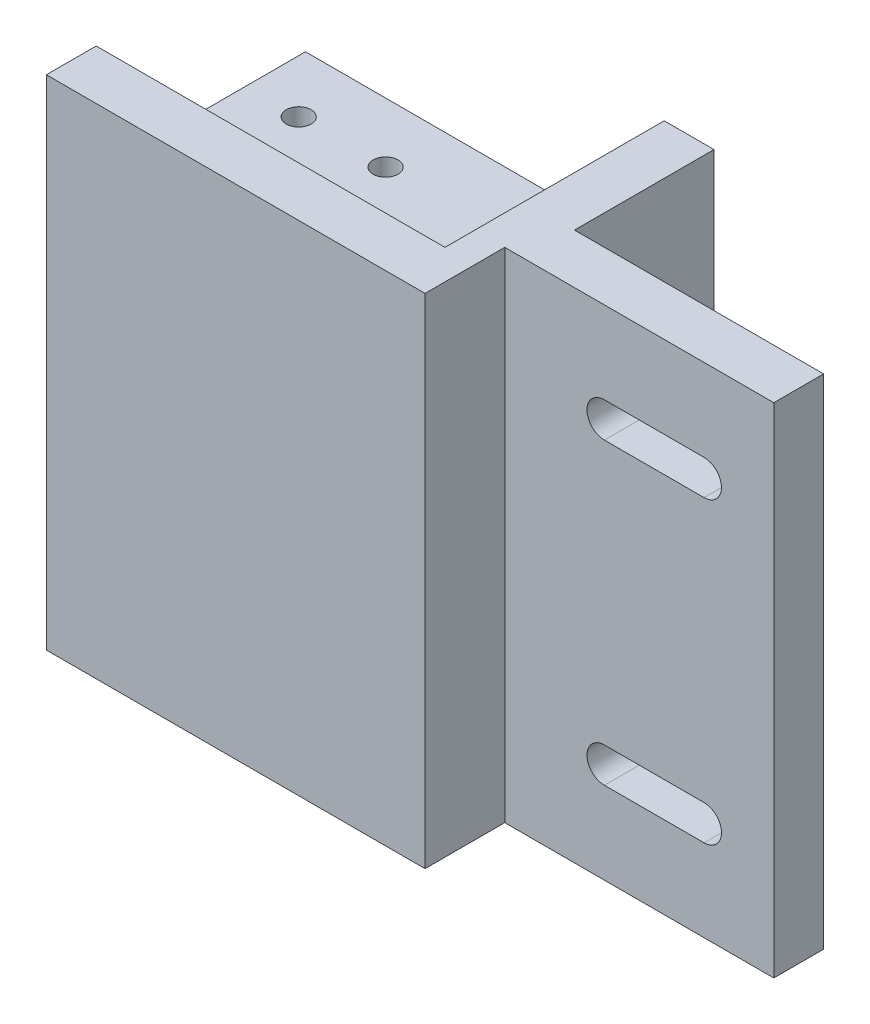
ISO-10303-21;
HEADER;
FILE_DESCRIPTION(('STEP AP214'),'2;1');
FILE_NAME('part.step','',(''),(''),'','','');
FILE_SCHEMA(('AUTOMOTIVE_DESIGN { 1 0 10303 214 1 1 1 1 }'));
ENDSEC;
DATA;
#1=APPLICATION_CONTEXT('core data for automotive mechanical design processes');
#2=APPLICATION_PROTOCOL_DEFINITION('international standard','automotive_design',2000,#1);
#3=PRODUCT_CONTEXT('',#1,'mechanical');
#4=PRODUCT('Part','Part','',(#3));
#5=PRODUCT_RELATED_PRODUCT_CATEGORY('part','',(#4));
#6=PRODUCT_DEFINITION_FORMATION('','',#4);
#7=PRODUCT_DEFINITION_CONTEXT('part definition',#1,'design');
#8=PRODUCT_DEFINITION('design','',#6,#7);
#9=PRODUCT_DEFINITION_SHAPE('','',#8);
#10=(LENGTH_UNIT() NAMED_UNIT(*) SI_UNIT(.MILLI.,.METRE.));
#11=(NAMED_UNIT(*) PLANE_ANGLE_UNIT() SI_UNIT($,.RADIAN.));
#12=(NAMED_UNIT(*) SI_UNIT($,.STERADIAN.) SOLID_ANGLE_UNIT());
#13=UNCERTAINTY_MEASURE_WITH_UNIT(LENGTH_MEASURE(1.E-05),#10,'distance_accuracy_value','');
#14=(GEOMETRIC_REPRESENTATION_CONTEXT(3) GLOBAL_UNCERTAINTY_ASSIGNED_CONTEXT((#13)) GLOBAL_UNIT_ASSIGNED_CONTEXT((#10,
#11,#12)) REPRESENTATION_CONTEXT('',''));
#15=CARTESIAN_POINT('',(0.,0.,0.));
#16=DIRECTION('',(0.,0.,1.));
#17=DIRECTION('',(1.,0.,0.));
#18=AXIS2_PLACEMENT_3D('',#15,#16,#17);
#19=CARTESIAN_POINT('',(50.,-25.,5.));
#20=DIRECTION('',(-1.,0.,0.));
#21=DIRECTION('',(0.,0.,1.));
#22=AXIS2_PLACEMENT_3D('',#19,#20,#21);
#23=PLANE('',#22);
#24=DIRECTION('',(0.,1.,0.));
#25=VECTOR('',#24,1.);
#26=CARTESIAN_POINT('',(50.,-25.,-3.));
#27=LINE('',#26,#25);
#28=CARTESIAN_POINT('',(50.,-25.,-3.));
#29=VERTEX_POINT('',#28);
#30=CARTESIAN_POINT('',(50.,25.,-3.));
#31=VERTEX_POINT('',#30);
#32=EDGE_CURVE('E180',#29,#31,#27,.T.);
#33=ORIENTED_EDGE('',*,*,#32,.F.);
#34=DIRECTION('',(0.,0.,-1.));
#35=VECTOR('',#34,1.);
#36=CARTESIAN_POINT('',(50.,-25.,5.));
#37=LINE('',#36,#35);
#38=CARTESIAN_POINT('',(50.,-25.,-8.));
#39=VERTEX_POINT('',#38);
#40=EDGE_CURVE('E203',#29,#39,#37,.T.);
#41=ORIENTED_EDGE('',*,*,#40,.T.);
#42=DIRECTION('',(0.,-1.,0.));
#43=VECTOR('',#42,1.);
#44=CARTESIAN_POINT('',(50.,25.,-8.));
#45=LINE('',#44,#43);
#46=CARTESIAN_POINT('',(50.,25.,-8.));
#47=VERTEX_POINT('',#46);
#48=EDGE_CURVE('E201',#47,#39,#45,.T.);
#49=ORIENTED_EDGE('',*,*,#48,.F.);
#50=DIRECTION('',(0.,0.,-1.));
#51=VECTOR('',#50,1.);
#52=CARTESIAN_POINT('',(50.,25.,5.));
#53=LINE('',#52,#51);
#54=EDGE_CURVE('E195',#31,#47,#53,.T.);
#55=ORIENTED_EDGE('',*,*,#54,.F.);
#56=EDGE_LOOP('',(#33,#41,#49,#55));
#57=FACE_BOUND('',#56,.T.);
#58=ADVANCED_FACE('F34',(#57),#23,.F.);
#59=CARTESIAN_POINT('',(33.,15.,5.));
#60=DIRECTION('',(0.,0.,-1.));
#61=DIRECTION('',(-1.,0.,0.));
#62=AXIS2_PLACEMENT_3D('',#59,#60,#61);
#63=CYLINDRICAL_SURFACE('',#62,1.75);
#64=DIRECTION('',(0.,0.,-1.));
#65=VECTOR('',#64,1.);
#66=CARTESIAN_POINT('',(33.,16.75,5.));
#67=LINE('',#66,#65);
#68=CARTESIAN_POINT('',(33.,16.75,-3.));
#69=VERTEX_POINT('',#68);
#70=CARTESIAN_POINT('',(33.,16.75,-8.));
#71=VERTEX_POINT('',#70);
#72=EDGE_CURVE('E340',#69,#71,#67,.T.);
#73=ORIENTED_EDGE('',*,*,#72,.F.);
#74=CARTESIAN_POINT('',(33.,15.,-3.));
#75=DIRECTION('',(0.,0.,1.));
#76=DIRECTION('',(1.,0.,0.));
#77=AXIS2_PLACEMENT_3D('',#74,#75,#76);
#78=CIRCLE('',#77,1.75);
#79=CARTESIAN_POINT('',(33.,13.25,-3.));
#80=VERTEX_POINT('',#79);
#81=EDGE_CURVE('E56',#69,#80,#78,.T.);
#82=ORIENTED_EDGE('',*,*,#81,.T.);
#83=DIRECTION('',(0.,0.,-1.));
#84=VECTOR('',#83,1.);
#85=CARTESIAN_POINT('',(33.,13.25,5.));
#86=LINE('',#85,#84);
#87=CARTESIAN_POINT('',(33.,13.25,-8.));
#88=VERTEX_POINT('',#87);
#89=EDGE_CURVE('E334',#80,#88,#86,.T.);
#90=ORIENTED_EDGE('',*,*,#89,.T.);
#91=CARTESIAN_POINT('',(33.,15.,-8.));
#92=DIRECTION('',(0.,0.,1.));
#93=DIRECTION('',(1.,0.,0.));
#94=AXIS2_PLACEMENT_3D('',#91,#92,#93);
#95=CIRCLE('',#94,1.75);
#96=EDGE_CURVE('E217',#88,#71,#95,.F.);
#97=ORIENTED_EDGE('',*,*,#96,.T.);
#98=EDGE_LOOP('',(#73,#82,#90,#97));
#99=FACE_BOUND('',#98,.T.);
#100=ADVANCED_FACE('F427',(#99),#63,.F.);
#101=CARTESIAN_POINT('',(33.,13.25,5.));
#102=DIRECTION('',(0.,1.,0.));
#103=DIRECTION('',(0.,0.,1.));
#104=AXIS2_PLACEMENT_3D('',#101,#102,#103);
#105=PLANE('',#104);
#106=ORIENTED_EDGE('',*,*,#89,.F.);
#107=DIRECTION('',(1.,0.,0.));
#108=VECTOR('',#107,1.);
#109=CARTESIAN_POINT('',(33.,13.25,-3.));
#110=LINE('',#109,#108);
#111=CARTESIAN_POINT('',(43.,13.25,-3.));
#112=VERTEX_POINT('',#111);
#113=EDGE_CURVE('E356',#80,#112,#110,.T.);
#114=ORIENTED_EDGE('',*,*,#113,.T.);
#115=DIRECTION('',(0.,0.,-1.));
#116=VECTOR('',#115,1.);
#117=CARTESIAN_POINT('',(43.,13.25,5.));
#118=LINE('',#117,#116);
#119=CARTESIAN_POINT('',(43.,13.25,-8.));
#120=VERTEX_POINT('',#119);
#121=EDGE_CURVE('E336',#112,#120,#118,.T.);
#122=ORIENTED_EDGE('',*,*,#121,.T.);
#123=DIRECTION('',(-1.,0.,0.));
#124=VECTOR('',#123,1.);
#125=CARTESIAN_POINT('',(0.,13.25,-8.));
#126=LINE('',#125,#124);
#127=EDGE_CURVE('E214',#120,#88,#126,.T.);
#128=ORIENTED_EDGE('',*,*,#127,.T.);
#129=EDGE_LOOP('',(#106,#114,#122,#128));
#130=FACE_BOUND('',#129,.T.);
#131=ADVANCED_FACE('F431',(#130),#105,.T.);
#132=CARTESIAN_POINT('',(43.,15.,5.));
#133=DIRECTION('',(0.,0.,-1.));
#134=DIRECTION('',(-1.,0.,0.));
#135=AXIS2_PLACEMENT_3D('',#132,#133,#134);
#136=CYLINDRICAL_SURFACE('',#135,1.75);
#137=ORIENTED_EDGE('',*,*,#121,.F.);
#138=CARTESIAN_POINT('',(43.,15.,-3.));
#139=DIRECTION('',(0.,0.,1.));
#140=DIRECTION('',(1.,0.,0.));
#141=AXIS2_PLACEMENT_3D('',#138,#139,#140);
#142=CIRCLE('',#141,1.75);
#143=CARTESIAN_POINT('',(43.,16.75,-3.));
#144=VERTEX_POINT('',#143);
#145=EDGE_CURVE('E359',#112,#144,#142,.T.);
#146=ORIENTED_EDGE('',*,*,#145,.T.);
#147=DIRECTION('',(0.,0.,-1.));
#148=VECTOR('',#147,1.);
#149=CARTESIAN_POINT('',(43.,16.75,5.));
#150=LINE('',#149,#148);
#151=CARTESIAN_POINT('',(43.,16.75,-8.));
#152=VERTEX_POINT('',#151);
#153=EDGE_CURVE('E338',#144,#152,#150,.T.);
#154=ORIENTED_EDGE('',*,*,#153,.T.);
#155=CARTESIAN_POINT('',(43.,15.,-8.));
#156=DIRECTION('',(0.,0.,1.));
#157=DIRECTION('',(1.,0.,0.));
#158=AXIS2_PLACEMENT_3D('',#155,#156,#157);
#159=CIRCLE('',#158,1.75);
#160=EDGE_CURVE('E206',#152,#120,#159,.F.);
#161=ORIENTED_EDGE('',*,*,#160,.T.);
#162=EDGE_LOOP('',(#137,#146,#154,#161));
#163=FACE_BOUND('',#162,.T.);
#164=ADVANCED_FACE('F437',(#163),#136,.F.);
#165=CARTESIAN_POINT('',(33.,16.75,5.));
#166=DIRECTION('',(0.,-1.,0.));
#167=DIRECTION('',(0.,0.,-1.));
#168=AXIS2_PLACEMENT_3D('',#165,#166,#167);
#169=PLANE('',#168);
#170=ORIENTED_EDGE('',*,*,#153,.F.);
#171=DIRECTION('',(-1.,0.,0.));
#172=VECTOR('',#171,1.);
#173=CARTESIAN_POINT('',(33.,16.75,-3.));
#174=LINE('',#173,#172);
#175=EDGE_CURVE('E362',#144,#69,#174,.T.);
#176=ORIENTED_EDGE('',*,*,#175,.T.);
#177=ORIENTED_EDGE('',*,*,#72,.T.);
#178=DIRECTION('',(1.,0.,0.));
#179=VECTOR('',#178,1.);
#180=CARTESIAN_POINT('',(0.,16.75,-8.));
#181=LINE('',#180,#179);
#182=EDGE_CURVE('E202',#71,#152,#181,.T.);
#183=ORIENTED_EDGE('',*,*,#182,.T.);
#184=EDGE_LOOP('',(#170,#176,#177,#183));
#185=FACE_BOUND('',#184,.T.);
#186=ADVANCED_FACE('F569',(#185),#169,.T.);
#187=CARTESIAN_POINT('',(33.,-15.,5.));
#188=DIRECTION('',(0.,0.,-1.));
#189=DIRECTION('',(-1.,0.,0.));
#190=AXIS2_PLACEMENT_3D('',#187,#188,#189);
#191=CYLINDRICAL_SURFACE('',#190,1.75);
#192=DIRECTION('',(0.,0.,-1.));
#193=VECTOR('',#192,1.);
#194=CARTESIAN_POINT('',(33.,-13.25,5.));
#195=LINE('',#194,#193);
#196=CARTESIAN_POINT('',(33.,-13.25,-3.));
#197=VERTEX_POINT('',#196);
#198=CARTESIAN_POINT('',(33.,-13.25,-8.));
#199=VERTEX_POINT('',#198);
#200=EDGE_CURVE('E348',#197,#199,#195,.T.);
#201=ORIENTED_EDGE('',*,*,#200,.F.);
#202=CARTESIAN_POINT('',(33.,-15.,-3.));
#203=DIRECTION('',(0.,0.,1.));
#204=DIRECTION('',(1.,0.,0.));
#205=AXIS2_PLACEMENT_3D('',#202,#203,#204);
#206=CIRCLE('',#205,1.75);
#207=CARTESIAN_POINT('',(33.,-16.75,-3.));
#208=VERTEX_POINT('',#207);
#209=EDGE_CURVE('E364',#197,#208,#206,.T.);
#210=ORIENTED_EDGE('',*,*,#209,.T.);
#211=DIRECTION('',(0.,0.,-1.));
#212=VECTOR('',#211,1.);
#213=CARTESIAN_POINT('',(33.,-16.75,5.));
#214=LINE('',#213,#212);
#215=CARTESIAN_POINT('',(33.,-16.75,-8.));
#216=VERTEX_POINT('',#215);
#217=EDGE_CURVE('E342',#208,#216,#214,.T.);
#218=ORIENTED_EDGE('',*,*,#217,.T.);
#219=CARTESIAN_POINT('',(33.,-15.,-8.));
#220=DIRECTION('',(0.,0.,1.));
#221=DIRECTION('',(1.,0.,0.));
#222=AXIS2_PLACEMENT_3D('',#219,#220,#221);
#223=CIRCLE('',#222,1.75);
#224=EDGE_CURVE('E229',#216,#199,#223,.F.);
#225=ORIENTED_EDGE('',*,*,#224,.T.);
#226=EDGE_LOOP('',(#201,#210,#218,#225));
#227=FACE_BOUND('',#226,.T.);
#228=ADVANCED_FACE('F409',(#227),#191,.F.);
#229=CARTESIAN_POINT('',(33.,-16.75,5.));
#230=DIRECTION('',(0.,1.,0.));
#231=DIRECTION('',(0.,0.,1.));
#232=AXIS2_PLACEMENT_3D('',#229,#230,#231);
#233=PLANE('',#232);
#234=ORIENTED_EDGE('',*,*,#217,.F.);
#235=DIRECTION('',(1.,0.,0.));
#236=VECTOR('',#235,1.);
#237=CARTESIAN_POINT('',(33.,-16.75,-3.));
#238=LINE('',#237,#236);
#239=CARTESIAN_POINT('',(43.,-16.75,-3.));
#240=VERTEX_POINT('',#239);
#241=EDGE_CURVE('E367',#208,#240,#238,.T.);
#242=ORIENTED_EDGE('',*,*,#241,.T.);
#243=DIRECTION('',(0.,0.,-1.));
#244=VECTOR('',#243,1.);
#245=CARTESIAN_POINT('',(43.,-16.75,5.));
#246=LINE('',#245,#244);
#247=CARTESIAN_POINT('',(43.,-16.75,-8.));
#248=VERTEX_POINT('',#247);
#249=EDGE_CURVE('E344',#240,#248,#246,.T.);
#250=ORIENTED_EDGE('',*,*,#249,.T.);
#251=DIRECTION('',(-1.,0.,0.));
#252=VECTOR('',#251,1.);
#253=CARTESIAN_POINT('',(0.,-16.75,-8.));
#254=LINE('',#253,#252);
#255=EDGE_CURVE('E226',#248,#216,#254,.T.);
#256=ORIENTED_EDGE('',*,*,#255,.T.);
#257=EDGE_LOOP('',(#234,#242,#250,#256));
#258=FACE_BOUND('',#257,.T.);
#259=ADVANCED_FACE('F412',(#258),#233,.T.);
#260=CARTESIAN_POINT('',(43.,-15.,5.));
#261=DIRECTION('',(0.,0.,-1.));
#262=DIRECTION('',(-1.,0.,0.));
#263=AXIS2_PLACEMENT_3D('',#260,#261,#262);
#264=CYLINDRICAL_SURFACE('',#263,1.75);
#265=ORIENTED_EDGE('',*,*,#249,.F.);
#266=CARTESIAN_POINT('',(43.,-15.,-3.));
#267=DIRECTION('',(0.,0.,1.));
#268=DIRECTION('',(1.,0.,0.));
#269=AXIS2_PLACEMENT_3D('',#266,#267,#268);
#270=CIRCLE('',#269,1.75);
#271=CARTESIAN_POINT('',(43.,-13.25,-3.));
#272=VERTEX_POINT('',#271);
#273=EDGE_CURVE('E370',#240,#272,#270,.T.);
#274=ORIENTED_EDGE('',*,*,#273,.T.);
#275=DIRECTION('',(0.,0.,-1.));
#276=VECTOR('',#275,1.);
#277=CARTESIAN_POINT('',(43.,-13.25,5.));
#278=LINE('',#277,#276);
#279=CARTESIAN_POINT('',(43.,-13.25,-8.));
#280=VERTEX_POINT('',#279);
#281=EDGE_CURVE('E346',#272,#280,#278,.T.);
#282=ORIENTED_EDGE('',*,*,#281,.T.);
#283=CARTESIAN_POINT('',(43.,-15.,-8.));
#284=DIRECTION('',(0.,0.,1.));
#285=DIRECTION('',(1.,0.,0.));
#286=AXIS2_PLACEMENT_3D('',#283,#284,#285);
#287=CIRCLE('',#286,1.75);
#288=EDGE_CURVE('E223',#280,#248,#287,.F.);
#289=ORIENTED_EDGE('',*,*,#288,.T.);
#290=EDGE_LOOP('',(#265,#274,#282,#289));
#291=FACE_BOUND('',#290,.T.);
#292=ADVANCED_FACE('F415',(#291),#264,.F.);
#293=CARTESIAN_POINT('',(33.,-13.25,5.));
#294=DIRECTION('',(0.,-1.,0.));
#295=DIRECTION('',(0.,0.,-1.));
#296=AXIS2_PLACEMENT_3D('',#293,#294,#295);
#297=PLANE('',#296);
#298=ORIENTED_EDGE('',*,*,#281,.F.);
#299=DIRECTION('',(-1.,0.,0.));
#300=VECTOR('',#299,1.);
#301=CARTESIAN_POINT('',(33.,-13.25,-3.));
#302=LINE('',#301,#300);
#303=EDGE_CURVE('E12',#272,#197,#302,.T.);
#304=ORIENTED_EDGE('',*,*,#303,.T.);
#305=ORIENTED_EDGE('',*,*,#200,.T.);
#306=DIRECTION('',(1.,0.,0.));
#307=VECTOR('',#306,1.);
#308=CARTESIAN_POINT('',(0.,-13.25,-8.));
#309=LINE('',#308,#307);
#310=EDGE_CURVE('E220',#199,#280,#309,.T.);
#311=ORIENTED_EDGE('',*,*,#310,.T.);
#312=EDGE_LOOP('',(#298,#304,#305,#311));
#313=FACE_BOUND('',#312,.T.);
#314=ADVANCED_FACE('F418',(#313),#297,.T.);
#315=CARTESIAN_POINT('',(0.,0.,5.));
#316=DIRECTION('',(0.,0.,-1.));
#317=DIRECTION('',(-1.,0.,0.));
#318=AXIS2_PLACEMENT_3D('',#315,#316,#317);
#319=PLANE('',#318);
#320=DIRECTION('',(1.,0.,0.));
#321=VECTOR('',#320,1.);
#322=CARTESIAN_POINT('',(-50.,-25.,5.));
#323=LINE('',#322,#321);
#324=CARTESIAN_POINT('',(-15.,-25.,5.));
#325=VERTEX_POINT('',#324);
#326=CARTESIAN_POINT('',(23.,-25.,5.));
#327=VERTEX_POINT('',#326);
#328=EDGE_CURVE('E208',#325,#327,#323,.T.);
#329=ORIENTED_EDGE('',*,*,#328,.T.);
#330=DIRECTION('',(0.,-1.,0.));
#331=VECTOR('',#330,1.);
#332=CARTESIAN_POINT('',(23.,-25.,5.));
#333=LINE('',#332,#331);
#334=CARTESIAN_POINT('',(23.,25.,5.));
#335=VERTEX_POINT('',#334);
#336=EDGE_CURVE('E190',#335,#327,#333,.T.);
#337=ORIENTED_EDGE('',*,*,#336,.F.);
#338=DIRECTION('',(-1.,0.,0.));
#339=VECTOR('',#338,1.);
#340=CARTESIAN_POINT('',(-50.,25.,5.));
#341=LINE('',#340,#339);
#342=CARTESIAN_POINT('',(-15.,25.,5.));
#343=VERTEX_POINT('',#342);
#344=EDGE_CURVE('E253',#335,#343,#341,.T.);
#345=ORIENTED_EDGE('',*,*,#344,.T.);
#346=DIRECTION('',(0.,-1.,0.));
#347=VECTOR('',#346,1.);
#348=CARTESIAN_POINT('',(-15.,0.,5.));
#349=LINE('',#348,#347);
#350=EDGE_CURVE('E350',#343,#325,#349,.T.);
#351=ORIENTED_EDGE('',*,*,#350,.T.);
#352=EDGE_LOOP('',(#329,#337,#345,#351));
#353=FACE_BOUND('',#352,.T.);
#354=ADVANCED_FACE('F382',(#353),#319,.F.);
#355=CARTESIAN_POINT('',(0.,0.,-8.));
#356=DIRECTION('',(0.,0.,1.));
#357=DIRECTION('',(1.,0.,0.));
#358=AXIS2_PLACEMENT_3D('',#355,#356,#357);
#359=PLANE('',#358);
#360=ORIENTED_EDGE('',*,*,#96,.F.);
#361=ORIENTED_EDGE('',*,*,#127,.F.);
#362=ORIENTED_EDGE('',*,*,#160,.F.);
#363=ORIENTED_EDGE('',*,*,#182,.F.);
#364=EDGE_LOOP('',(#360,#361,#362,#363));
#365=FACE_BOUND('',#364,.T.);
#366=DIRECTION('',(0.,1.,0.));
#367=VECTOR('',#366,1.);
#368=CARTESIAN_POINT('',(25.,25.,-8.));
#369=LINE('',#368,#367);
#370=CARTESIAN_POINT('',(25.,-25.,-8.));
#371=VERTEX_POINT('',#370);
#372=CARTESIAN_POINT('',(25.,25.,-8.));
#373=VERTEX_POINT('',#372);
#374=EDGE_CURVE('E331',#371,#373,#369,.T.);
#375=ORIENTED_EDGE('',*,*,#374,.T.);
#376=DIRECTION('',(1.,0.,0.));
#377=VECTOR('',#376,1.);
#378=CARTESIAN_POINT('',(25.,25.,-8.));
#379=LINE('',#378,#377);
#380=EDGE_CURVE('E329',#373,#47,#379,.T.);
#381=ORIENTED_EDGE('',*,*,#380,.T.);
#382=ORIENTED_EDGE('',*,*,#48,.T.);
#383=DIRECTION('',(-1.,0.,0.));
#384=VECTOR('',#383,1.);
#385=CARTESIAN_POINT('',(25.,-25.,-8.));
#386=LINE('',#385,#384);
#387=EDGE_CURVE('E326',#39,#371,#386,.T.);
#388=ORIENTED_EDGE('',*,*,#387,.T.);
#389=EDGE_LOOP('',(#375,#381,#382,#388));
#390=FACE_BOUND('',#389,.T.);
#391=ORIENTED_EDGE('',*,*,#224,.F.);
#392=ORIENTED_EDGE('',*,*,#255,.F.);
#393=ORIENTED_EDGE('',*,*,#288,.F.);
#394=ORIENTED_EDGE('',*,*,#310,.F.);
#395=EDGE_LOOP('',(#391,#392,#393,#394));
#396=FACE_BOUND('',#395,.T.);
#397=ADVANCED_FACE('F398',(#365,#390,#396),#359,.F.);
#398=CARTESIAN_POINT('',(25.,-25.,-22.));
#399=DIRECTION('',(1.,0.,0.));
#400=DIRECTION('',(0.,0.,-1.));
#401=AXIS2_PLACEMENT_3D('',#398,#399,#400);
#402=PLANE('',#401);
#403=DIRECTION('',(0.,0.,1.));
#404=VECTOR('',#403,1.);
#405=CARTESIAN_POINT('',(25.,25.,-22.));
#406=LINE('',#405,#404);
#407=CARTESIAN_POINT('',(25.,25.,-22.));
#408=VERTEX_POINT('',#407);
#409=EDGE_CURVE('E266',#408,#373,#406,.T.);
#410=ORIENTED_EDGE('',*,*,#409,.T.);
#411=ORIENTED_EDGE('',*,*,#374,.F.);
#412=DIRECTION('',(0.,0.,1.));
#413=VECTOR('',#412,1.);
#414=CARTESIAN_POINT('',(25.,-25.,-22.));
#415=LINE('',#414,#413);
#416=CARTESIAN_POINT('',(25.,-25.,-22.));
#417=VERTEX_POINT('',#416);
#418=EDGE_CURVE('E262',#417,#371,#415,.T.);
#419=ORIENTED_EDGE('',*,*,#418,.F.);
#420=DIRECTION('',(0.,1.,0.));
#421=VECTOR('',#420,1.);
#422=CARTESIAN_POINT('',(25.,-25.,-22.));
#423=LINE('',#422,#421);
#424=EDGE_CURVE('E275',#417,#408,#423,.T.);
#425=ORIENTED_EDGE('',*,*,#424,.T.);
#426=EDGE_LOOP('',(#410,#411,#419,#425));
#427=FACE_BOUND('',#426,.T.);
#428=ADVANCED_FACE('F394',(#427),#402,.T.);
#429=CARTESIAN_POINT('',(0.,0.,0.));
#430=DIRECTION('',(0.,0.,-1.));
#431=DIRECTION('',(-1.,0.,0.));
#432=AXIS2_PLACEMENT_3D('',#429,#430,#431);
#433=PLANE('',#432);
#434=DIRECTION('',(0.,-1.,0.));
#435=VECTOR('',#434,1.);
#436=CARTESIAN_POINT('',(-15.,-25.,0.));
#437=LINE('',#436,#435);
#438=CARTESIAN_POINT('',(-15.,25.,0.));
#439=VERTEX_POINT('',#438);
#440=CARTESIAN_POINT('',(-15.,-25.,0.));
#441=VERTEX_POINT('',#440);
#442=EDGE_CURVE('E249',#439,#441,#437,.T.);
#443=ORIENTED_EDGE('',*,*,#442,.F.);
#444=DIRECTION('',(-1.,0.,0.));
#445=VECTOR('',#444,1.);
#446=CARTESIAN_POINT('',(-50.,25.,0.));
#447=LINE('',#446,#445);
#448=CARTESIAN_POINT('',(20.,25.,0.));
#449=VERTEX_POINT('',#448);
#450=EDGE_CURVE('E254',#449,#439,#447,.T.);
#451=ORIENTED_EDGE('',*,*,#450,.F.);
#452=DIRECTION('',(0.,-1.,0.));
#453=VECTOR('',#452,1.);
#454=CARTESIAN_POINT('',(20.,-25.,0.));
#455=LINE('',#454,#453);
#456=CARTESIAN_POINT('',(20.,-25.,0.));
#457=VERTEX_POINT('',#456);
#458=EDGE_CURVE('E252',#449,#457,#455,.T.);
#459=ORIENTED_EDGE('',*,*,#458,.T.);
#460=DIRECTION('',(1.,0.,0.));
#461=VECTOR('',#460,1.);
#462=CARTESIAN_POINT('',(-50.,-25.,0.));
#463=LINE('',#462,#461);
#464=EDGE_CURVE('E236',#441,#457,#463,.T.);
#465=ORIENTED_EDGE('',*,*,#464,.F.);
#466=EDGE_LOOP('',(#443,#451,#459,#465));
#467=FACE_BOUND('',#466,.T.);
#468=DIRECTION('',(0.,1.,0.));
#469=VECTOR('',#468,1.);
#470=CARTESIAN_POINT('',(15.,19.,0.));
#471=LINE('',#470,#469);
#472=CARTESIAN_POINT('',(15.,15.,0.));
#473=VERTEX_POINT('',#472);
#474=CARTESIAN_POINT('',(15.,19.,0.));
#475=VERTEX_POINT('',#474);
#476=EDGE_CURVE('E302',#473,#475,#471,.T.);
#477=ORIENTED_EDGE('',*,*,#476,.T.);
#478=DIRECTION('',(-1.,0.,0.));
#479=VECTOR('',#478,1.);
#480=CARTESIAN_POINT('',(-10.,19.,0.));
#481=LINE('',#480,#479);
#482=CARTESIAN_POINT('',(-10.,19.,0.));
#483=VERTEX_POINT('',#482);
#484=EDGE_CURVE('E300',#475,#483,#481,.T.);
#485=ORIENTED_EDGE('',*,*,#484,.T.);
#486=DIRECTION('',(0.,-1.,0.));
#487=VECTOR('',#486,1.);
#488=CARTESIAN_POINT('',(-10.,19.,0.));
#489=LINE('',#488,#487);
#490=CARTESIAN_POINT('',(-10.,15.,0.));
#491=VERTEX_POINT('',#490);
#492=EDGE_CURVE('E298',#483,#491,#489,.T.);
#493=ORIENTED_EDGE('',*,*,#492,.T.);
#494=DIRECTION('',(1.,0.,0.));
#495=VECTOR('',#494,1.);
#496=CARTESIAN_POINT('',(-10.,15.,0.));
#497=LINE('',#496,#495);
#498=EDGE_CURVE('E295',#491,#473,#497,.T.);
#499=ORIENTED_EDGE('',*,*,#498,.T.);
#500=EDGE_LOOP('',(#477,#485,#493,#499));
#501=FACE_BOUND('',#500,.T.);
#502=ADVANCED_FACE('F246',(#467,#501),#433,.T.);
#503=CARTESIAN_POINT('',(-50.,25.,5.));
#504=DIRECTION('',(0.,-1.,0.));
#505=DIRECTION('',(0.,0.,-1.));
#506=AXIS2_PLACEMENT_3D('',#503,#504,#505);
#507=PLANE('',#506);
#508=ORIENTED_EDGE('',*,*,#344,.F.);
#509=DIRECTION('',(0.,0.,1.));
#510=VECTOR('',#509,1.);
#511=CARTESIAN_POINT('',(23.,25.,-3.));
#512=LINE('',#511,#510);
#513=CARTESIAN_POINT('',(23.,25.,-3.));
#514=VERTEX_POINT('',#513);
#515=EDGE_CURVE('E197',#514,#335,#512,.T.);
#516=ORIENTED_EDGE('',*,*,#515,.F.);
#517=DIRECTION('',(-1.,0.,0.));
#518=VECTOR('',#517,1.);
#519=CARTESIAN_POINT('',(50.,25.,-3.));
#520=LINE('',#519,#518);
#521=EDGE_CURVE('E183',#31,#514,#520,.T.);
#522=ORIENTED_EDGE('',*,*,#521,.F.);
#523=ORIENTED_EDGE('',*,*,#54,.T.);
#524=ORIENTED_EDGE('',*,*,#380,.F.);
#525=ORIENTED_EDGE('',*,*,#409,.F.);
#526=DIRECTION('',(-1.,0.,0.));
#527=VECTOR('',#526,1.);
#528=CARTESIAN_POINT('',(25.,25.,-22.));
#529=LINE('',#528,#527);
#530=CARTESIAN_POINT('',(20.,25.,-22.));
#531=VERTEX_POINT('',#530);
#532=EDGE_CURVE('E263',#408,#531,#529,.T.);
#533=ORIENTED_EDGE('',*,*,#532,.T.);
#534=DIRECTION('',(0.,0.,1.));
#535=VECTOR('',#534,1.);
#536=CARTESIAN_POINT('',(20.,25.,-22.));
#537=LINE('',#536,#535);
#538=EDGE_CURVE('E256',#531,#449,#537,.T.);
#539=ORIENTED_EDGE('',*,*,#538,.T.);
#540=ORIENTED_EDGE('',*,*,#450,.T.);
#541=DIRECTION('',(0.,0.,-1.));
#542=VECTOR('',#541,1.);
#543=CARTESIAN_POINT('',(-15.,25.,10.));
#544=LINE('',#543,#542);
#545=EDGE_CURVE('E352',#343,#439,#544,.T.);
#546=ORIENTED_EDGE('',*,*,#545,.F.);
#547=EDGE_LOOP('',(#508,#516,#522,#523,#524,#525,#533,#539,#540,#546));
#548=FACE_BOUND('',#547,.T.);
#549=ADVANCED_FACE('F194',(#548),#507,.F.);
#550=CARTESIAN_POINT('',(-50.,-25.,5.));
#551=DIRECTION('',(0.,1.,0.));
#552=DIRECTION('',(0.,0.,1.));
#553=AXIS2_PLACEMENT_3D('',#550,#551,#552);
#554=PLANE('',#553);
#555=DIRECTION('',(1.,0.,0.));
#556=VECTOR('',#555,1.);
#557=CARTESIAN_POINT('',(50.,-25.,-3.));
#558=LINE('',#557,#556);
#559=CARTESIAN_POINT('',(23.,-25.,-3.));
#560=VERTEX_POINT('',#559);
#561=EDGE_CURVE('E186',#560,#29,#558,.T.);
#562=ORIENTED_EDGE('',*,*,#561,.F.);
#563=DIRECTION('',(0.,0.,1.));
#564=VECTOR('',#563,1.);
#565=CARTESIAN_POINT('',(23.,-25.,-3.));
#566=LINE('',#565,#564);
#567=EDGE_CURVE('E373',#560,#327,#566,.T.);
#568=ORIENTED_EDGE('',*,*,#567,.T.);
#569=ORIENTED_EDGE('',*,*,#328,.F.);
#570=DIRECTION('',(0.,0.,-1.));
#571=VECTOR('',#570,1.);
#572=CARTESIAN_POINT('',(-15.,-25.,5.));
#573=LINE('',#572,#571);
#574=EDGE_CURVE('E41',#325,#441,#573,.T.);
#575=ORIENTED_EDGE('',*,*,#574,.T.);
#576=ORIENTED_EDGE('',*,*,#464,.T.);
#577=DIRECTION('',(0.,0.,1.));
#578=VECTOR('',#577,1.);
#579=CARTESIAN_POINT('',(20.,-25.,-22.));
#580=LINE('',#579,#578);
#581=CARTESIAN_POINT('',(20.,-25.,-22.));
#582=VERTEX_POINT('',#581);
#583=EDGE_CURVE('E260',#582,#457,#580,.T.);
#584=ORIENTED_EDGE('',*,*,#583,.F.);
#585=DIRECTION('',(1.,0.,0.));
#586=VECTOR('',#585,1.);
#587=CARTESIAN_POINT('',(25.,-25.,-22.));
#588=LINE('',#587,#586);
#589=EDGE_CURVE('E278',#582,#417,#588,.T.);
#590=ORIENTED_EDGE('',*,*,#589,.T.);
#591=ORIENTED_EDGE('',*,*,#418,.T.);
#592=ORIENTED_EDGE('',*,*,#387,.F.);
#593=ORIENTED_EDGE('',*,*,#40,.F.);
#594=EDGE_LOOP('',(#562,#568,#569,#575,#576,#584,#590,#591,#592,#593));
#595=FACE_BOUND('',#594,.T.);
#596=ADVANCED_FACE('F235',(#595),#554,.F.);
#597=CARTESIAN_POINT('',(20.,-25.,-22.));
#598=DIRECTION('',(-1.,0.,0.));
#599=DIRECTION('',(0.,0.,1.));
#600=AXIS2_PLACEMENT_3D('',#597,#598,#599);
#601=PLANE('',#600);
#602=ORIENTED_EDGE('',*,*,#458,.F.);
#603=ORIENTED_EDGE('',*,*,#538,.F.);
#604=DIRECTION('',(0.,-1.,0.));
#605=VECTOR('',#604,1.);
#606=CARTESIAN_POINT('',(20.,-25.,-22.));
#607=LINE('',#606,#605);
#608=EDGE_CURVE('E271',#531,#582,#607,.T.);
#609=ORIENTED_EDGE('',*,*,#608,.T.);
#610=ORIENTED_EDGE('',*,*,#583,.T.);
#611=EDGE_LOOP('',(#602,#603,#609,#610));
#612=FACE_BOUND('',#611,.T.);
#613=ADVANCED_FACE('F388',(#612),#601,.T.);
#614=CARTESIAN_POINT('',(0.,0.,-22.));
#615=DIRECTION('',(0.,0.,1.));
#616=DIRECTION('',(1.,0.,0.));
#617=AXIS2_PLACEMENT_3D('',#614,#615,#616);
#618=PLANE('',#617);
#619=ORIENTED_EDGE('',*,*,#608,.F.);
#620=ORIENTED_EDGE('',*,*,#532,.F.);
#621=ORIENTED_EDGE('',*,*,#424,.F.);
#622=ORIENTED_EDGE('',*,*,#589,.F.);
#623=EDGE_LOOP('',(#619,#620,#621,#622));
#624=FACE_BOUND('',#623,.T.);
#625=ADVANCED_FACE('F392',(#624),#618,.F.);
#626=CARTESIAN_POINT('',(15.,19.,-16.));
#627=DIRECTION('',(1.,0.,0.));
#628=DIRECTION('',(0.,0.,-1.));
#629=AXIS2_PLACEMENT_3D('',#626,#627,#628);
#630=PLANE('',#629);
#631=ORIENTED_EDGE('',*,*,#476,.F.);
#632=DIRECTION('',(0.,0.,1.));
#633=VECTOR('',#632,1.);
#634=CARTESIAN_POINT('',(15.,15.,-16.));
#635=LINE('',#634,#633);
#636=CARTESIAN_POINT('',(15.,15.,-16.));
#637=VERTEX_POINT('',#636);
#638=EDGE_CURVE('E272',#637,#473,#635,.T.);
#639=ORIENTED_EDGE('',*,*,#638,.F.);
#640=DIRECTION('',(0.,1.,0.));
#641=VECTOR('',#640,1.);
#642=CARTESIAN_POINT('',(15.,19.,-16.));
#643=LINE('',#642,#641);
#644=CARTESIAN_POINT('',(15.,19.,-16.));
#645=VERTEX_POINT('',#644);
#646=EDGE_CURVE('E297',#637,#645,#643,.T.);
#647=ORIENTED_EDGE('',*,*,#646,.T.);
#648=DIRECTION('',(0.,0.,1.));
#649=VECTOR('',#648,1.);
#650=CARTESIAN_POINT('',(15.,19.,-16.));
#651=LINE('',#650,#649);
#652=EDGE_CURVE('E283',#645,#475,#651,.T.);
#653=ORIENTED_EDGE('',*,*,#652,.T.);
#654=EDGE_LOOP('',(#631,#639,#647,#653));
#655=FACE_BOUND('',#654,.T.);
#656=ADVANCED_FACE('F460',(#655),#630,.T.);
#657=CARTESIAN_POINT('',(-10.,15.,-16.));
#658=DIRECTION('',(0.,-1.,0.));
#659=DIRECTION('',(0.,0.,-1.));
#660=AXIS2_PLACEMENT_3D('',#657,#658,#659);
#661=PLANE('',#660);
#662=CARTESIAN_POINT('',(4.04,15.,-10.));
#663=DIRECTION('',(0.,-1.,0.));
#664=DIRECTION('',(0.,0.,-1.));
#665=AXIS2_PLACEMENT_3D('',#662,#663,#664);
#666=CIRCLE('',#665,1.25);
#667=CARTESIAN_POINT('',(4.04,15.,-11.25));
#668=VERTEX_POINT('',#667);
#669=EDGE_CURVE('E320',#668,#668,#666,.T.);
#670=ORIENTED_EDGE('',*,*,#669,.F.);
#671=EDGE_LOOP('',(#670));
#672=FACE_BOUND('',#671,.T.);
#673=CARTESIAN_POINT('',(-4.68,15.,-10.));
#674=DIRECTION('',(0.,-1.,0.));
#675=DIRECTION('',(0.,0.,-1.));
#676=AXIS2_PLACEMENT_3D('',#673,#674,#675);
#677=CIRCLE('',#676,1.25);
#678=CARTESIAN_POINT('',(-4.68,15.,-11.25));
#679=VERTEX_POINT('',#678);
#680=EDGE_CURVE('E304',#679,#679,#677,.T.);
#681=ORIENTED_EDGE('',*,*,#680,.F.);
#682=EDGE_LOOP('',(#681));
#683=FACE_BOUND('',#682,.T.);
#684=ORIENTED_EDGE('',*,*,#498,.F.);
#685=DIRECTION('',(0.,0.,1.));
#686=VECTOR('',#685,1.);
#687=CARTESIAN_POINT('',(-10.,15.,-16.));
#688=LINE('',#687,#686);
#689=CARTESIAN_POINT('',(-10.,15.,-16.));
#690=VERTEX_POINT('',#689);
#691=EDGE_CURVE('E290',#690,#491,#688,.T.);
#692=ORIENTED_EDGE('',*,*,#691,.F.);
#693=DIRECTION('',(1.,0.,0.));
#694=VECTOR('',#693,1.);
#695=CARTESIAN_POINT('',(-10.,15.,-16.));
#696=LINE('',#695,#694);
#697=EDGE_CURVE('E287',#690,#637,#696,.T.);
#698=ORIENTED_EDGE('',*,*,#697,.T.);
#699=ORIENTED_EDGE('',*,*,#638,.T.);
#700=EDGE_LOOP('',(#684,#692,#698,#699));
#701=FACE_BOUND('',#700,.T.);
#702=ADVANCED_FACE('F456',(#672,#683,#701),#661,.T.);
#703=CARTESIAN_POINT('',(-10.,19.,-16.));
#704=DIRECTION('',(-1.,0.,0.));
#705=DIRECTION('',(0.,0.,1.));
#706=AXIS2_PLACEMENT_3D('',#703,#704,#705);
#707=PLANE('',#706);
#708=ORIENTED_EDGE('',*,*,#492,.F.);
#709=DIRECTION('',(0.,0.,1.));
#710=VECTOR('',#709,1.);
#711=CARTESIAN_POINT('',(-10.,19.,-16.));
#712=LINE('',#711,#710);
#713=CARTESIAN_POINT('',(-10.,19.,-16.));
#714=VERTEX_POINT('',#713);
#715=EDGE_CURVE('E286',#714,#483,#712,.T.);
#716=ORIENTED_EDGE('',*,*,#715,.F.);
#717=DIRECTION('',(0.,-1.,0.));
#718=VECTOR('',#717,1.);
#719=CARTESIAN_POINT('',(-10.,19.,-16.));
#720=LINE('',#719,#718);
#721=EDGE_CURVE('E307',#714,#690,#720,.T.);
#722=ORIENTED_EDGE('',*,*,#721,.T.);
#723=ORIENTED_EDGE('',*,*,#691,.T.);
#724=EDGE_LOOP('',(#708,#716,#722,#723));
#725=FACE_BOUND('',#724,.T.);
#726=ADVANCED_FACE('F459',(#725),#707,.T.);
#727=CARTESIAN_POINT('',(-10.,19.,-16.));
#728=DIRECTION('',(0.,1.,0.));
#729=DIRECTION('',(0.,0.,1.));
#730=AXIS2_PLACEMENT_3D('',#727,#728,#729);
#731=PLANE('',#730);
#732=CARTESIAN_POINT('',(4.04,19.,-10.));
#733=DIRECTION('',(0.,1.,0.));
#734=DIRECTION('',(0.,0.,1.));
#735=AXIS2_PLACEMENT_3D('',#732,#733,#734);
#736=CIRCLE('',#735,1.25);
#737=CARTESIAN_POINT('',(4.04,19.,-8.75));
#738=VERTEX_POINT('',#737);
#739=EDGE_CURVE('E323',#738,#738,#736,.T.);
#740=ORIENTED_EDGE('',*,*,#739,.F.);
#741=EDGE_LOOP('',(#740));
#742=FACE_BOUND('',#741,.T.);
#743=CARTESIAN_POINT('',(-4.68,19.,-10.));
#744=DIRECTION('',(0.,1.,0.));
#745=DIRECTION('',(0.,0.,1.));
#746=AXIS2_PLACEMENT_3D('',#743,#744,#745);
#747=CIRCLE('',#746,1.25);
#748=CARTESIAN_POINT('',(-4.68,19.,-8.75));
#749=VERTEX_POINT('',#748);
#750=EDGE_CURVE('E317',#749,#749,#747,.T.);
#751=ORIENTED_EDGE('',*,*,#750,.F.);
#752=EDGE_LOOP('',(#751));
#753=FACE_BOUND('',#752,.T.);
#754=ORIENTED_EDGE('',*,*,#484,.F.);
#755=ORIENTED_EDGE('',*,*,#652,.F.);
#756=DIRECTION('',(-1.,0.,0.));
#757=VECTOR('',#756,1.);
#758=CARTESIAN_POINT('',(-10.,19.,-16.));
#759=LINE('',#758,#757);
#760=EDGE_CURVE('E310',#645,#714,#759,.T.);
#761=ORIENTED_EDGE('',*,*,#760,.T.);
#762=ORIENTED_EDGE('',*,*,#715,.T.);
#763=EDGE_LOOP('',(#754,#755,#761,#762));
#764=FACE_BOUND('',#763,.T.);
#765=ADVANCED_FACE('F454',(#742,#753,#764),#731,.T.);
#766=CARTESIAN_POINT('',(0.,0.,-16.));
#767=DIRECTION('',(0.,0.,1.));
#768=DIRECTION('',(1.,0.,0.));
#769=AXIS2_PLACEMENT_3D('',#766,#767,#768);
#770=PLANE('',#769);
#771=ORIENTED_EDGE('',*,*,#646,.F.);
#772=ORIENTED_EDGE('',*,*,#697,.F.);
#773=ORIENTED_EDGE('',*,*,#721,.F.);
#774=ORIENTED_EDGE('',*,*,#760,.F.);
#775=EDGE_LOOP('',(#771,#772,#773,#774));
#776=FACE_BOUND('',#775,.T.);
#777=ADVANCED_FACE('F450',(#776),#770,.F.);
#778=CARTESIAN_POINT('',(-4.68,-21.,-10.));
#779=DIRECTION('',(0.,1.,0.));
#780=DIRECTION('',(0.,0.,1.));
#781=AXIS2_PLACEMENT_3D('',#778,#779,#780);
#782=CYLINDRICAL_SURFACE('',#781,1.25);
#783=ORIENTED_EDGE('',*,*,#680,.T.);
#784=EDGE_LOOP('',(#783));
#785=FACE_BOUND('',#784,.T.);
#786=ORIENTED_EDGE('',*,*,#750,.T.);
#787=EDGE_LOOP('',(#786));
#788=FACE_BOUND('',#787,.T.);
#789=ADVANCED_FACE('F446',(#785,#788),#782,.F.);
#790=CARTESIAN_POINT('',(4.04,-21.,-10.));
#791=DIRECTION('',(0.,1.,0.));
#792=DIRECTION('',(0.,0.,1.));
#793=AXIS2_PLACEMENT_3D('',#790,#791,#792);
#794=CYLINDRICAL_SURFACE('',#793,1.25);
#795=ORIENTED_EDGE('',*,*,#669,.T.);
#796=EDGE_LOOP('',(#795));
#797=FACE_BOUND('',#796,.T.);
#798=ORIENTED_EDGE('',*,*,#739,.T.);
#799=EDGE_LOOP('',(#798));
#800=FACE_BOUND('',#799,.T.);
#801=ADVANCED_FACE('F443',(#797,#800),#794,.F.);
#802=CARTESIAN_POINT('',(-15.,-25.,10.));
#803=DIRECTION('',(1.,0.,0.));
#804=DIRECTION('',(0.,0.,-1.));
#805=AXIS2_PLACEMENT_3D('',#802,#803,#804);
#806=PLANE('',#805);
#807=ORIENTED_EDGE('',*,*,#545,.T.);
#808=ORIENTED_EDGE('',*,*,#442,.T.);
#809=ORIENTED_EDGE('',*,*,#574,.F.);
#810=ORIENTED_EDGE('',*,*,#350,.F.);
#811=EDGE_LOOP('',(#807,#808,#809,#810));
#812=FACE_BOUND('',#811,.T.);
#813=ADVANCED_FACE('F384',(#812),#806,.F.);
#814=CARTESIAN_POINT('',(23.,-25.,-3.));
#815=DIRECTION('',(-1.,0.,0.));
#816=DIRECTION('',(0.,0.,1.));
#817=AXIS2_PLACEMENT_3D('',#814,#815,#816);
#818=PLANE('',#817);
#819=ORIENTED_EDGE('',*,*,#336,.T.);
#820=ORIENTED_EDGE('',*,*,#567,.F.);
#821=DIRECTION('',(0.,-1.,0.));
#822=VECTOR('',#821,1.);
#823=CARTESIAN_POINT('',(23.,-25.,-3.));
#824=LINE('',#823,#822);
#825=EDGE_CURVE('E48',#514,#560,#824,.T.);
#826=ORIENTED_EDGE('',*,*,#825,.F.);
#827=ORIENTED_EDGE('',*,*,#515,.T.);
#828=EDGE_LOOP('',(#819,#820,#826,#827));
#829=FACE_BOUND('',#828,.T.);
#830=ADVANCED_FACE('F380',(#829),#818,.F.);
#831=CARTESIAN_POINT('',(0.,0.,-3.));
#832=DIRECTION('',(0.,0.,1.));
#833=DIRECTION('',(1.,0.,0.));
#834=AXIS2_PLACEMENT_3D('',#831,#832,#833);
#835=PLANE('',#834);
#836=ORIENTED_EDGE('',*,*,#175,.F.);
#837=ORIENTED_EDGE('',*,*,#145,.F.);
#838=ORIENTED_EDGE('',*,*,#113,.F.);
#839=ORIENTED_EDGE('',*,*,#81,.F.);
#840=EDGE_LOOP('',(#836,#837,#838,#839));
#841=FACE_BOUND('',#840,.T.);
#842=ORIENTED_EDGE('',*,*,#303,.F.);
#843=ORIENTED_EDGE('',*,*,#273,.F.);
#844=ORIENTED_EDGE('',*,*,#241,.F.);
#845=ORIENTED_EDGE('',*,*,#209,.F.);
#846=EDGE_LOOP('',(#842,#843,#844,#845));
#847=FACE_BOUND('',#846,.T.);
#848=ORIENTED_EDGE('',*,*,#32,.T.);
#849=ORIENTED_EDGE('',*,*,#521,.T.);
#850=ORIENTED_EDGE('',*,*,#825,.T.);
#851=ORIENTED_EDGE('',*,*,#561,.T.);
#852=EDGE_LOOP('',(#848,#849,#850,#851));
#853=FACE_BOUND('',#852,.T.);
#854=ADVANCED_FACE('F182',(#841,#847,#853),#835,.T.);
#855=CLOSED_SHELL('',(#58,#100,#131,#164,#186,#228,#259,#292,#314,#354,#397,#428,#502,#549,#596,
#613,#625,#656,#702,#726,#765,#777,#789,#801,#813,#830,#854));
#856=MANIFOLD_SOLID_BREP('B2',#855);
#857=ADVANCED_BREP_SHAPE_REPRESENTATION('',(#18,#856),#14);
#858=SHAPE_DEFINITION_REPRESENTATION(#9,#857);
ENDSEC;
END-ISO-10303-21;
